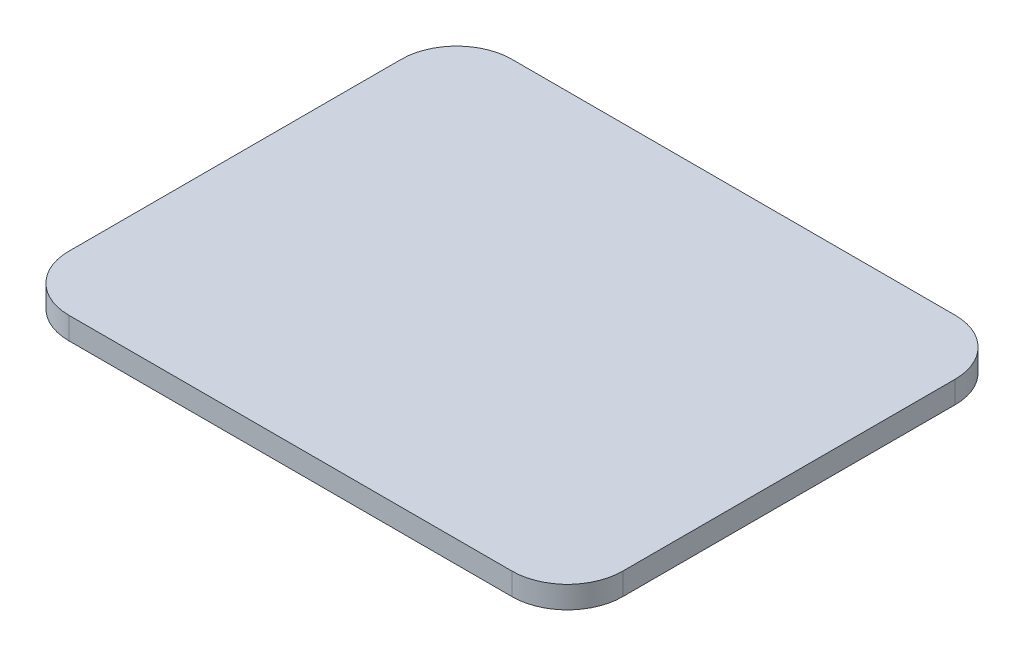
ISO-10303-21;
HEADER;
FILE_DESCRIPTION(('STEP AP214'),'2;1');
FILE_NAME('part.step','',(''),(''),'','','');
FILE_SCHEMA(('AUTOMOTIVE_DESIGN { 1 0 10303 214 1 1 1 1 }'));
ENDSEC;
DATA;
#1=APPLICATION_CONTEXT('core data for automotive mechanical design processes');
#2=APPLICATION_PROTOCOL_DEFINITION('international standard','automotive_design',2000,#1);
#3=PRODUCT_CONTEXT('',#1,'mechanical');
#4=PRODUCT('Part','Part','',(#3));
#5=PRODUCT_RELATED_PRODUCT_CATEGORY('part','',(#4));
#6=PRODUCT_DEFINITION_FORMATION('','',#4);
#7=PRODUCT_DEFINITION_CONTEXT('part definition',#1,'design');
#8=PRODUCT_DEFINITION('design','',#6,#7);
#9=PRODUCT_DEFINITION_SHAPE('','',#8);
#10=(LENGTH_UNIT() NAMED_UNIT(*) SI_UNIT(.MILLI.,.METRE.));
#11=(NAMED_UNIT(*) PLANE_ANGLE_UNIT() SI_UNIT($,.RADIAN.));
#12=(NAMED_UNIT(*) SI_UNIT($,.STERADIAN.) SOLID_ANGLE_UNIT());
#13=UNCERTAINTY_MEASURE_WITH_UNIT(LENGTH_MEASURE(1.E-05),#10,'distance_accuracy_value','');
#14=(GEOMETRIC_REPRESENTATION_CONTEXT(3) GLOBAL_UNCERTAINTY_ASSIGNED_CONTEXT((#13)) GLOBAL_UNIT_ASSIGNED_CONTEXT((#10,
#11,#12)) REPRESENTATION_CONTEXT('',''));
#15=CARTESIAN_POINT('',(0.,0.,0.));
#16=DIRECTION('',(0.,0.,1.));
#17=DIRECTION('',(1.,0.,0.));
#18=AXIS2_PLACEMENT_3D('',#15,#16,#17);
#19=CARTESIAN_POINT('',(250.,20.,200.));
#20=DIRECTION('',(-1.,0.,0.));
#21=DIRECTION('',(0.,0.,1.));
#22=AXIS2_PLACEMENT_3D('',#19,#20,#21);
#23=PLANE('',#22);
#24=DIRECTION('',(0.,0.,-1.));
#25=VECTOR('',#24,1.);
#26=CARTESIAN_POINT('',(250.,0.,200.));
#27=LINE('',#26,#25);
#28=CARTESIAN_POINT('',(250.,0.,150.));
#29=VERTEX_POINT('',#28);
#30=CARTESIAN_POINT('',(250.,0.,-150.));
#31=VERTEX_POINT('',#30);
#32=EDGE_CURVE('E141',#29,#31,#27,.T.);
#33=ORIENTED_EDGE('',*,*,#32,.T.);
#34=DIRECTION('',(0.,-1.,0.));
#35=VECTOR('',#34,1.);
#36=CARTESIAN_POINT('',(250.,20.,-150.));
#37=LINE('',#36,#35);
#38=CARTESIAN_POINT('',(250.,20.,-150.));
#39=VERTEX_POINT('',#38);
#40=EDGE_CURVE('E11',#31,#39,#37,.F.);
#41=ORIENTED_EDGE('',*,*,#40,.T.);
#42=DIRECTION('',(0.,0.,-1.));
#43=VECTOR('',#42,1.);
#44=CARTESIAN_POINT('',(250.,20.,200.));
#45=LINE('',#44,#43);
#46=CARTESIAN_POINT('',(250.,20.,150.));
#47=VERTEX_POINT('',#46);
#48=EDGE_CURVE('E139',#47,#39,#45,.T.);
#49=ORIENTED_EDGE('',*,*,#48,.F.);
#50=DIRECTION('',(0.,-1.,0.));
#51=VECTOR('',#50,1.);
#52=CARTESIAN_POINT('',(250.,20.,150.));
#53=LINE('',#52,#51);
#54=EDGE_CURVE('E48',#47,#29,#53,.T.);
#55=ORIENTED_EDGE('',*,*,#54,.T.);
#56=EDGE_LOOP('',(#33,#41,#49,#55));
#57=FACE_BOUND('',#56,.T.);
#58=ADVANCED_FACE('F39',(#57),#23,.F.);
#59=CARTESIAN_POINT('',(-250.,20.,-200.));
#60=DIRECTION('',(0.,0.,1.));
#61=DIRECTION('',(1.,0.,0.));
#62=AXIS2_PLACEMENT_3D('',#59,#60,#61);
#63=PLANE('',#62);
#64=DIRECTION('',(-1.,0.,0.));
#65=VECTOR('',#64,1.);
#66=CARTESIAN_POINT('',(-250.,0.,-200.));
#67=LINE('',#66,#65);
#68=CARTESIAN_POINT('',(200.,0.,-200.));
#69=VERTEX_POINT('',#68);
#70=CARTESIAN_POINT('',(-200.,0.,-200.));
#71=VERTEX_POINT('',#70);
#72=EDGE_CURVE('E135',#69,#71,#67,.T.);
#73=ORIENTED_EDGE('',*,*,#72,.T.);
#74=DIRECTION('',(0.,-1.,0.));
#75=VECTOR('',#74,1.);
#76=CARTESIAN_POINT('',(-200.,20.,-200.));
#77=LINE('',#76,#75);
#78=CARTESIAN_POINT('',(-200.,20.,-200.));
#79=VERTEX_POINT('',#78);
#80=EDGE_CURVE('E111',#71,#79,#77,.F.);
#81=ORIENTED_EDGE('',*,*,#80,.T.);
#82=DIRECTION('',(-1.,0.,0.));
#83=VECTOR('',#82,1.);
#84=CARTESIAN_POINT('',(-250.,20.,-200.));
#85=LINE('',#84,#83);
#86=CARTESIAN_POINT('',(200.,20.,-200.));
#87=VERTEX_POINT('',#86);
#88=EDGE_CURVE('E193',#87,#79,#85,.T.);
#89=ORIENTED_EDGE('',*,*,#88,.F.);
#90=DIRECTION('',(0.,-1.,0.));
#91=VECTOR('',#90,1.);
#92=CARTESIAN_POINT('',(200.,20.,-200.));
#93=LINE('',#92,#91);
#94=EDGE_CURVE('E117',#87,#69,#93,.T.);
#95=ORIENTED_EDGE('',*,*,#94,.T.);
#96=EDGE_LOOP('',(#73,#81,#89,#95));
#97=FACE_BOUND('',#96,.T.);
#98=ADVANCED_FACE('F205',(#97),#63,.F.);
#99=CARTESIAN_POINT('',(-250.,20.,200.));
#100=DIRECTION('',(1.,0.,0.));
#101=DIRECTION('',(0.,0.,-1.));
#102=AXIS2_PLACEMENT_3D('',#99,#100,#101);
#103=PLANE('',#102);
#104=DIRECTION('',(0.,0.,1.));
#105=VECTOR('',#104,1.);
#106=CARTESIAN_POINT('',(-250.,20.,200.));
#107=LINE('',#106,#105);
#108=CARTESIAN_POINT('',(-250.,20.,-150.));
#109=VERTEX_POINT('',#108);
#110=CARTESIAN_POINT('',(-250.,20.,150.));
#111=VERTEX_POINT('',#110);
#112=EDGE_CURVE('E126',#109,#111,#107,.T.);
#113=ORIENTED_EDGE('',*,*,#112,.F.);
#114=DIRECTION('',(0.,-1.,0.));
#115=VECTOR('',#114,1.);
#116=CARTESIAN_POINT('',(-250.,20.,-150.));
#117=LINE('',#116,#115);
#118=CARTESIAN_POINT('',(-250.,0.,-150.));
#119=VERTEX_POINT('',#118);
#120=EDGE_CURVE('E110',#109,#119,#117,.T.);
#121=ORIENTED_EDGE('',*,*,#120,.T.);
#122=DIRECTION('',(0.,0.,1.));
#123=VECTOR('',#122,1.);
#124=CARTESIAN_POINT('',(-250.,0.,200.));
#125=LINE('',#124,#123);
#126=CARTESIAN_POINT('',(-250.,0.,150.));
#127=VERTEX_POINT('',#126);
#128=EDGE_CURVE('E124',#119,#127,#125,.T.);
#129=ORIENTED_EDGE('',*,*,#128,.T.);
#130=DIRECTION('',(0.,-1.,0.));
#131=VECTOR('',#130,1.);
#132=CARTESIAN_POINT('',(-250.,20.,150.));
#133=LINE('',#132,#131);
#134=EDGE_CURVE('E129',#127,#111,#133,.F.);
#135=ORIENTED_EDGE('',*,*,#134,.T.);
#136=EDGE_LOOP('',(#113,#121,#129,#135));
#137=FACE_BOUND('',#136,.T.);
#138=ADVANCED_FACE('F123',(#137),#103,.F.);
#139=CARTESIAN_POINT('',(-250.,20.,200.));
#140=DIRECTION('',(0.,0.,-1.));
#141=DIRECTION('',(-1.,0.,0.));
#142=AXIS2_PLACEMENT_3D('',#139,#140,#141);
#143=PLANE('',#142);
#144=DIRECTION('',(1.,0.,0.));
#145=VECTOR('',#144,1.);
#146=CARTESIAN_POINT('',(-250.,20.,200.));
#147=LINE('',#146,#145);
#148=CARTESIAN_POINT('',(-200.,20.,200.));
#149=VERTEX_POINT('',#148);
#150=CARTESIAN_POINT('',(200.,20.,200.));
#151=VERTEX_POINT('',#150);
#152=EDGE_CURVE('E146',#149,#151,#147,.T.);
#153=ORIENTED_EDGE('',*,*,#152,.F.);
#154=DIRECTION('',(0.,-1.,0.));
#155=VECTOR('',#154,1.);
#156=CARTESIAN_POINT('',(-200.,20.,200.));
#157=LINE('',#156,#155);
#158=CARTESIAN_POINT('',(-200.,0.,200.));
#159=VERTEX_POINT('',#158);
#160=EDGE_CURVE('E173',#149,#159,#157,.T.);
#161=ORIENTED_EDGE('',*,*,#160,.T.);
#162=DIRECTION('',(1.,0.,0.));
#163=VECTOR('',#162,1.);
#164=CARTESIAN_POINT('',(-250.,0.,200.));
#165=LINE('',#164,#163);
#166=CARTESIAN_POINT('',(200.,0.,200.));
#167=VERTEX_POINT('',#166);
#168=EDGE_CURVE('E134',#159,#167,#165,.T.);
#169=ORIENTED_EDGE('',*,*,#168,.T.);
#170=DIRECTION('',(0.,-1.,0.));
#171=VECTOR('',#170,1.);
#172=CARTESIAN_POINT('',(200.,20.,200.));
#173=LINE('',#172,#171);
#174=EDGE_CURVE('E55',#167,#151,#173,.F.);
#175=ORIENTED_EDGE('',*,*,#174,.T.);
#176=EDGE_LOOP('',(#153,#161,#169,#175));
#177=FACE_BOUND('',#176,.T.);
#178=ADVANCED_FACE('F209',(#177),#143,.F.);
#179=CARTESIAN_POINT('',(0.,20.,0.));
#180=DIRECTION('',(0.,-1.,0.));
#181=DIRECTION('',(0.,0.,-1.));
#182=AXIS2_PLACEMENT_3D('',#179,#180,#181);
#183=PLANE('',#182);
#184=ORIENTED_EDGE('',*,*,#88,.T.);
#185=CARTESIAN_POINT('',(-200.,20.,-150.));
#186=DIRECTION('',(0.,-1.,0.));
#187=DIRECTION('',(0.,0.,-1.));
#188=AXIS2_PLACEMENT_3D('',#185,#186,#187);
#189=CIRCLE('',#188,50.);
#190=EDGE_CURVE('E168',#79,#109,#189,.F.);
#191=ORIENTED_EDGE('',*,*,#190,.T.);
#192=ORIENTED_EDGE('',*,*,#112,.T.);
#193=CARTESIAN_POINT('',(-200.,20.,150.));
#194=DIRECTION('',(0.,-1.,0.));
#195=DIRECTION('',(0.,0.,-1.));
#196=AXIS2_PLACEMENT_3D('',#193,#194,#195);
#197=CIRCLE('',#196,50.);
#198=EDGE_CURVE('E62',#111,#149,#197,.F.);
#199=ORIENTED_EDGE('',*,*,#198,.T.);
#200=ORIENTED_EDGE('',*,*,#152,.T.);
#201=CARTESIAN_POINT('',(200.,20.,150.));
#202=DIRECTION('',(0.,-1.,0.));
#203=DIRECTION('',(0.,0.,-1.));
#204=AXIS2_PLACEMENT_3D('',#201,#202,#203);
#205=CIRCLE('',#204,50.);
#206=EDGE_CURVE('E160',#151,#47,#205,.F.);
#207=ORIENTED_EDGE('',*,*,#206,.T.);
#208=ORIENTED_EDGE('',*,*,#48,.T.);
#209=CARTESIAN_POINT('',(200.,20.,-150.));
#210=DIRECTION('',(0.,-1.,0.));
#211=DIRECTION('',(0.,0.,-1.));
#212=AXIS2_PLACEMENT_3D('',#209,#210,#211);
#213=CIRCLE('',#212,50.);
#214=EDGE_CURVE('E163',#39,#87,#213,.F.);
#215=ORIENTED_EDGE('',*,*,#214,.T.);
#216=EDGE_LOOP('',(#184,#191,#192,#199,#200,#207,#208,#215));
#217=FACE_BOUND('',#216,.T.);
#218=ADVANCED_FACE('F199',(#217),#183,.F.);
#219=CARTESIAN_POINT('',(0.,0.,0.));
#220=DIRECTION('',(0.,-1.,0.));
#221=DIRECTION('',(0.,0.,-1.));
#222=AXIS2_PLACEMENT_3D('',#219,#220,#221);
#223=PLANE('',#222);
#224=ORIENTED_EDGE('',*,*,#128,.F.);
#225=CARTESIAN_POINT('',(-200.,0.,-150.));
#226=DIRECTION('',(0.,-1.,0.));
#227=DIRECTION('',(0.,0.,-1.));
#228=AXIS2_PLACEMENT_3D('',#225,#226,#227);
#229=CIRCLE('',#228,50.);
#230=EDGE_CURVE('E106',#119,#71,#229,.T.);
#231=ORIENTED_EDGE('',*,*,#230,.T.);
#232=ORIENTED_EDGE('',*,*,#72,.F.);
#233=CARTESIAN_POINT('',(200.,0.,-150.));
#234=DIRECTION('',(0.,-1.,0.));
#235=DIRECTION('',(0.,0.,-1.));
#236=AXIS2_PLACEMENT_3D('',#233,#234,#235);
#237=CIRCLE('',#236,50.);
#238=EDGE_CURVE('E150',#69,#31,#237,.T.);
#239=ORIENTED_EDGE('',*,*,#238,.T.);
#240=ORIENTED_EDGE('',*,*,#32,.F.);
#241=CARTESIAN_POINT('',(200.,0.,150.));
#242=DIRECTION('',(0.,-1.,0.));
#243=DIRECTION('',(0.,0.,-1.));
#244=AXIS2_PLACEMENT_3D('',#241,#242,#243);
#245=CIRCLE('',#244,50.);
#246=EDGE_CURVE('E128',#29,#167,#245,.T.);
#247=ORIENTED_EDGE('',*,*,#246,.T.);
#248=ORIENTED_EDGE('',*,*,#168,.F.);
#249=CARTESIAN_POINT('',(-200.,0.,150.));
#250=DIRECTION('',(0.,-1.,0.));
#251=DIRECTION('',(0.,0.,-1.));
#252=AXIS2_PLACEMENT_3D('',#249,#250,#251);
#253=CIRCLE('',#252,50.);
#254=EDGE_CURVE('E118',#159,#127,#253,.T.);
#255=ORIENTED_EDGE('',*,*,#254,.T.);
#256=EDGE_LOOP('',(#224,#231,#232,#239,#240,#247,#248,#255));
#257=FACE_BOUND('',#256,.T.);
#258=ADVANCED_FACE('F131',(#257),#223,.T.);
#259=CARTESIAN_POINT('',(-200.,20.,-150.));
#260=DIRECTION('',(0.,-1.,0.));
#261=DIRECTION('',(0.,0.,-1.));
#262=AXIS2_PLACEMENT_3D('',#259,#260,#261);
#263=CYLINDRICAL_SURFACE('',#262,50.);
#264=ORIENTED_EDGE('',*,*,#190,.F.);
#265=ORIENTED_EDGE('',*,*,#80,.F.);
#266=ORIENTED_EDGE('',*,*,#230,.F.);
#267=ORIENTED_EDGE('',*,*,#120,.F.);
#268=EDGE_LOOP('',(#264,#265,#266,#267));
#269=FACE_BOUND('',#268,.T.);
#270=ADVANCED_FACE('F109',(#269),#263,.T.);
#271=CARTESIAN_POINT('',(-200.,20.,150.));
#272=DIRECTION('',(0.,-1.,0.));
#273=DIRECTION('',(0.,0.,-1.));
#274=AXIS2_PLACEMENT_3D('',#271,#272,#273);
#275=CYLINDRICAL_SURFACE('',#274,50.);
#276=ORIENTED_EDGE('',*,*,#198,.F.);
#277=ORIENTED_EDGE('',*,*,#134,.F.);
#278=ORIENTED_EDGE('',*,*,#254,.F.);
#279=ORIENTED_EDGE('',*,*,#160,.F.);
#280=EDGE_LOOP('',(#276,#277,#278,#279));
#281=FACE_BOUND('',#280,.T.);
#282=ADVANCED_FACE('F208',(#281),#275,.T.);
#283=CARTESIAN_POINT('',(200.,20.,-150.));
#284=DIRECTION('',(0.,-1.,0.));
#285=DIRECTION('',(0.,0.,-1.));
#286=AXIS2_PLACEMENT_3D('',#283,#284,#285);
#287=CYLINDRICAL_SURFACE('',#286,50.);
#288=ORIENTED_EDGE('',*,*,#214,.F.);
#289=ORIENTED_EDGE('',*,*,#40,.F.);
#290=ORIENTED_EDGE('',*,*,#238,.F.);
#291=ORIENTED_EDGE('',*,*,#94,.F.);
#292=EDGE_LOOP('',(#288,#289,#290,#291));
#293=FACE_BOUND('',#292,.T.);
#294=ADVANCED_FACE('F203',(#293),#287,.T.);
#295=CARTESIAN_POINT('',(200.,20.,150.));
#296=DIRECTION('',(0.,-1.,0.));
#297=DIRECTION('',(0.,0.,-1.));
#298=AXIS2_PLACEMENT_3D('',#295,#296,#297);
#299=CYLINDRICAL_SURFACE('',#298,50.);
#300=ORIENTED_EDGE('',*,*,#206,.F.);
#301=ORIENTED_EDGE('',*,*,#174,.F.);
#302=ORIENTED_EDGE('',*,*,#246,.F.);
#303=ORIENTED_EDGE('',*,*,#54,.F.);
#304=EDGE_LOOP('',(#300,#301,#302,#303));
#305=FACE_BOUND('',#304,.T.);
#306=ADVANCED_FACE('F41',(#305),#299,.T.);
#307=CLOSED_SHELL('',(#58,#98,#138,#178,#218,#258,#270,#282,#294,#306));
#308=MANIFOLD_SOLID_BREP('B2',#307);
#309=ADVANCED_BREP_SHAPE_REPRESENTATION('',(#18,#308),#14);
#310=SHAPE_DEFINITION_REPRESENTATION(#9,#309);
ENDSEC;
END-ISO-10303-21;
